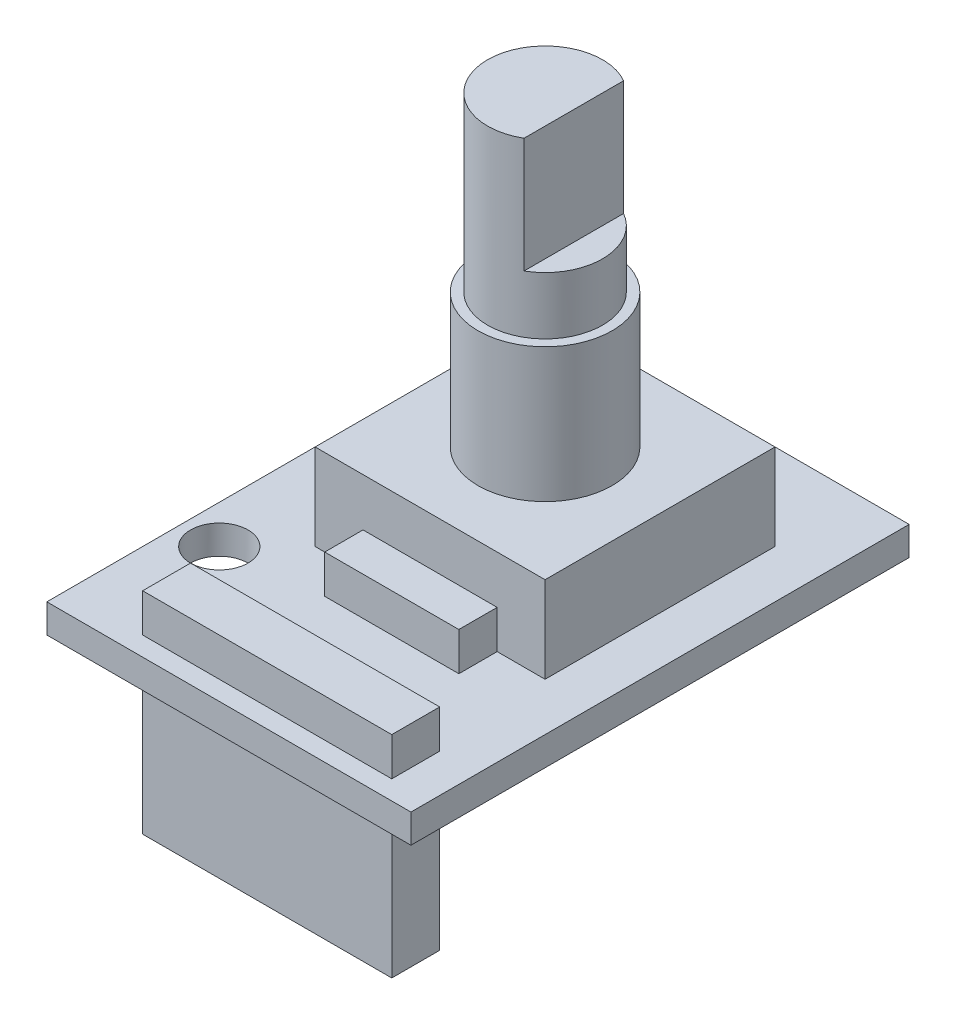
ISO-10303-21;
HEADER;
FILE_DESCRIPTION(('STEP AP214'),'2;1');
FILE_NAME('part.step','',(''),(''),'','','');
FILE_SCHEMA(('AUTOMOTIVE_DESIGN { 1 0 10303 214 1 1 1 1 }'));
ENDSEC;
DATA;
#1=APPLICATION_CONTEXT('core data for automotive mechanical design processes');
#2=APPLICATION_PROTOCOL_DEFINITION('international standard','automotive_design',2000,#1);
#3=PRODUCT_CONTEXT('',#1,'mechanical');
#4=PRODUCT('Part','Part','',(#3));
#5=PRODUCT_RELATED_PRODUCT_CATEGORY('part','',(#4));
#6=PRODUCT_DEFINITION_FORMATION('','',#4);
#7=PRODUCT_DEFINITION_CONTEXT('part definition',#1,'design');
#8=PRODUCT_DEFINITION('design','',#6,#7);
#9=PRODUCT_DEFINITION_SHAPE('','',#8);
#10=(LENGTH_UNIT() NAMED_UNIT(*) SI_UNIT(.MILLI.,.METRE.));
#11=(NAMED_UNIT(*) PLANE_ANGLE_UNIT() SI_UNIT($,.RADIAN.));
#12=(NAMED_UNIT(*) SI_UNIT($,.STERADIAN.) SOLID_ANGLE_UNIT());
#13=UNCERTAINTY_MEASURE_WITH_UNIT(LENGTH_MEASURE(1.E-05),#10,'distance_accuracy_value','');
#14=(GEOMETRIC_REPRESENTATION_CONTEXT(3) GLOBAL_UNCERTAINTY_ASSIGNED_CONTEXT((#13)) GLOBAL_UNIT_ASSIGNED_CONTEXT((#10,
#11,#12)) REPRESENTATION_CONTEXT('',''));
#15=CARTESIAN_POINT('',(0.,0.,0.));
#16=DIRECTION('',(0.,0.,1.));
#17=DIRECTION('',(1.,0.,0.));
#18=AXIS2_PLACEMENT_3D('',#15,#16,#17);
#19=CARTESIAN_POINT('',(0.,1.5,0.));
#20=DIRECTION('',(0.,-1.,0.));
#21=DIRECTION('',(0.,0.,-1.));
#22=AXIS2_PLACEMENT_3D('',#19,#20,#21);
#23=PLANE('',#22);
#24=DIRECTION('',(-1.,0.,0.));
#25=VECTOR('',#24,1.);
#26=CARTESIAN_POINT('',(0.,1.5,12.));
#27=LINE('',#26,#25);
#28=CARTESIAN_POINT('',(7.5,1.5,12.));
#29=VERTEX_POINT('',#28);
#30=CARTESIAN_POINT('',(-5.5,1.5,12.));
#31=VERTEX_POINT('',#30);
#32=EDGE_CURVE('E363',#29,#31,#27,.T.);
#33=ORIENTED_EDGE('',*,*,#32,.T.);
#34=DIRECTION('',(0.,0.,-1.));
#35=VECTOR('',#34,1.);
#36=CARTESIAN_POINT('',(-5.5,1.5,0.));
#37=LINE('',#36,#35);
#38=CARTESIAN_POINT('',(-5.5,1.5,9.5));
#39=VERTEX_POINT('',#38);
#40=EDGE_CURVE('E372',#31,#39,#37,.T.);
#41=ORIENTED_EDGE('',*,*,#40,.T.);
#42=DIRECTION('',(1.,0.,0.));
#43=VECTOR('',#42,1.);
#44=CARTESIAN_POINT('',(0.,1.5,9.5));
#45=LINE('',#44,#43);
#46=CARTESIAN_POINT('',(7.5,1.5,9.5));
#47=VERTEX_POINT('',#46);
#48=EDGE_CURVE('E369',#39,#47,#45,.T.);
#49=ORIENTED_EDGE('',*,*,#48,.T.);
#50=DIRECTION('',(0.,0.,1.));
#51=VECTOR('',#50,1.);
#52=CARTESIAN_POINT('',(7.5,1.5,0.));
#53=LINE('',#52,#51);
#54=EDGE_CURVE('E366',#47,#29,#53,.T.);
#55=ORIENTED_EDGE('',*,*,#54,.T.);
#56=EDGE_LOOP('',(#33,#41,#49,#55));
#57=FACE_BOUND('',#56,.T.);
#58=CARTESIAN_POINT('',(-7.5,1.5,-7.5));
#59=DIRECTION('',(0.,1.,0.));
#60=DIRECTION('',(0.,0.,1.));
#61=AXIS2_PLACEMENT_3D('',#58,#59,#60);
#62=CIRCLE('',#61,1.5);
#63=CARTESIAN_POINT('',(-7.5,1.5,-6.));
#64=VERTEX_POINT('',#63);
#65=EDGE_CURVE('E324',#64,#64,#62,.T.);
#66=ORIENTED_EDGE('',*,*,#65,.F.);
#67=EDGE_LOOP('',(#66));
#68=FACE_BOUND('',#67,.T.);
#69=CARTESIAN_POINT('',(-7.5,1.5,6.));
#70=DIRECTION('',(0.,1.,0.));
#71=DIRECTION('',(0.,0.,1.));
#72=AXIS2_PLACEMENT_3D('',#69,#70,#71);
#73=CIRCLE('',#72,1.5);
#74=CARTESIAN_POINT('',(-7.5,1.5,7.5));
#75=VERTEX_POINT('',#74);
#76=EDGE_CURVE('E375',#75,#75,#73,.T.);
#77=ORIENTED_EDGE('',*,*,#76,.F.);
#78=EDGE_LOOP('',(#77));
#79=FACE_BOUND('',#78,.T.);
#80=DIRECTION('',(0.,0.,1.));
#81=VECTOR('',#80,1.);
#82=CARTESIAN_POINT('',(-9.5,1.5,13.));
#83=LINE('',#82,#81);
#84=CARTESIAN_POINT('',(-9.5,1.5,-13.));
#85=VERTEX_POINT('',#84);
#86=CARTESIAN_POINT('',(-9.5,1.5,13.));
#87=VERTEX_POINT('',#86);
#88=EDGE_CURVE('E290',#85,#87,#83,.T.);
#89=ORIENTED_EDGE('',*,*,#88,.T.);
#90=DIRECTION('',(1.,0.,0.));
#91=VECTOR('',#90,1.);
#92=CARTESIAN_POINT('',(-9.5,1.5,13.));
#93=LINE('',#92,#91);
#94=CARTESIAN_POINT('',(9.5,1.5,13.));
#95=VERTEX_POINT('',#94);
#96=EDGE_CURVE('E293',#87,#95,#93,.T.);
#97=ORIENTED_EDGE('',*,*,#96,.T.);
#98=DIRECTION('',(0.,0.,-1.));
#99=VECTOR('',#98,1.);
#100=CARTESIAN_POINT('',(9.5,1.5,13.));
#101=LINE('',#100,#99);
#102=CARTESIAN_POINT('',(9.5,1.5,-13.));
#103=VERTEX_POINT('',#102);
#104=EDGE_CURVE('E296',#95,#103,#101,.T.);
#105=ORIENTED_EDGE('',*,*,#104,.T.);
#106=DIRECTION('',(-1.,0.,0.));
#107=VECTOR('',#106,1.);
#108=CARTESIAN_POINT('',(-9.5,1.5,-13.));
#109=LINE('',#108,#107);
#110=EDGE_CURVE('E298',#103,#85,#109,.T.);
#111=ORIENTED_EDGE('',*,*,#110,.T.);
#112=EDGE_LOOP('',(#89,#97,#105,#111));
#113=FACE_BOUND('',#112,.T.);
#114=DIRECTION('',(0.,0.,1.));
#115=VECTOR('',#114,1.);
#116=CARTESIAN_POINT('',(-2.5,1.5,3.5));
#117=LINE('',#116,#115);
#118=CARTESIAN_POINT('',(-2.5,1.5,3.5));
#119=VERTEX_POINT('',#118);
#120=CARTESIAN_POINT('',(-2.5,1.5,5.5));
#121=VERTEX_POINT('',#120);
#122=EDGE_CURVE('E245',#119,#121,#117,.T.);
#123=ORIENTED_EDGE('',*,*,#122,.F.);
#124=DIRECTION('',(1.,0.,0.));
#125=VECTOR('',#124,1.);
#126=CARTESIAN_POINT('',(-5.,1.5,3.5));
#127=LINE('',#126,#125);
#128=CARTESIAN_POINT('',(-5.,1.5,3.5));
#129=VERTEX_POINT('',#128);
#130=EDGE_CURVE('E255',#129,#119,#127,.T.);
#131=ORIENTED_EDGE('',*,*,#130,.F.);
#132=DIRECTION('',(0.,0.,1.));
#133=VECTOR('',#132,1.);
#134=CARTESIAN_POINT('',(-5.,1.5,3.5));
#135=LINE('',#134,#133);
#136=CARTESIAN_POINT('',(-5.,1.5,-8.5));
#137=VERTEX_POINT('',#136);
#138=EDGE_CURVE('E270',#137,#129,#135,.T.);
#139=ORIENTED_EDGE('',*,*,#138,.F.);
#140=DIRECTION('',(-1.,0.,0.));
#141=VECTOR('',#140,1.);
#142=CARTESIAN_POINT('',(-5.,1.5,-8.5));
#143=LINE('',#142,#141);
#144=CARTESIAN_POINT('',(-2.5,1.5,-8.5));
#145=VERTEX_POINT('',#144);
#146=EDGE_CURVE('E268',#145,#137,#143,.T.);
#147=ORIENTED_EDGE('',*,*,#146,.F.);
#148=DIRECTION('',(0.,0.,1.));
#149=VECTOR('',#148,1.);
#150=CARTESIAN_POINT('',(-2.5,1.5,-8.5));
#151=LINE('',#150,#149);
#152=CARTESIAN_POINT('',(-2.5,1.5,-10.5));
#153=VERTEX_POINT('',#152);
#154=EDGE_CURVE('E64',#153,#145,#151,.T.);
#155=ORIENTED_EDGE('',*,*,#154,.F.);
#156=DIRECTION('',(-1.,0.,0.));
#157=VECTOR('',#156,1.);
#158=CARTESIAN_POINT('',(-2.5,1.5,-10.5));
#159=LINE('',#158,#157);
#160=CARTESIAN_POINT('',(4.5,1.5,-10.5));
#161=VERTEX_POINT('',#160);
#162=EDGE_CURVE('E428',#161,#153,#159,.T.);
#163=ORIENTED_EDGE('',*,*,#162,.F.);
#164=DIRECTION('',(0.,0.,-1.));
#165=VECTOR('',#164,1.);
#166=CARTESIAN_POINT('',(4.5,1.5,-8.5));
#167=LINE('',#166,#165);
#168=CARTESIAN_POINT('',(4.5,1.5,-8.5));
#169=VERTEX_POINT('',#168);
#170=EDGE_CURVE('E425',#169,#161,#167,.T.);
#171=ORIENTED_EDGE('',*,*,#170,.F.);
#172=CARTESIAN_POINT('',(7.,1.5,-8.5));
#173=VERTEX_POINT('',#172);
#174=EDGE_CURVE('E274',#173,#169,#143,.T.);
#175=ORIENTED_EDGE('',*,*,#174,.F.);
#176=DIRECTION('',(0.,0.,-1.));
#177=VECTOR('',#176,1.);
#178=CARTESIAN_POINT('',(7.,1.5,3.5));
#179=LINE('',#178,#177);
#180=CARTESIAN_POINT('',(7.,1.5,3.5));
#181=VERTEX_POINT('',#180);
#182=EDGE_CURVE('E264',#181,#173,#179,.T.);
#183=ORIENTED_EDGE('',*,*,#182,.F.);
#184=CARTESIAN_POINT('',(4.5,1.5,3.5));
#185=VERTEX_POINT('',#184);
#186=EDGE_CURVE('E265',#185,#181,#127,.T.);
#187=ORIENTED_EDGE('',*,*,#186,.F.);
#188=DIRECTION('',(0.,0.,-1.));
#189=VECTOR('',#188,1.);
#190=CARTESIAN_POINT('',(4.5,1.5,3.5));
#191=LINE('',#190,#189);
#192=CARTESIAN_POINT('',(4.5,1.5,5.5));
#193=VERTEX_POINT('',#192);
#194=EDGE_CURVE('E671',#193,#185,#191,.T.);
#195=ORIENTED_EDGE('',*,*,#194,.F.);
#196=DIRECTION('',(1.,0.,0.));
#197=VECTOR('',#196,1.);
#198=CARTESIAN_POINT('',(-2.5,1.5,5.5));
#199=LINE('',#198,#197);
#200=EDGE_CURVE('E258',#121,#193,#199,.T.);
#201=ORIENTED_EDGE('',*,*,#200,.F.);
#202=EDGE_LOOP('',(#123,#131,#139,#147,#155,#163,#171,#175,#183,#187,#195,#201));
#203=FACE_BOUND('',#202,.T.);
#204=ADVANCED_FACE('F41',(#57,#68,#79,#113,#203),#23,.F.);
#205=CARTESIAN_POINT('',(-5.,6.,3.5));
#206=DIRECTION('',(0.,0.,-1.));
#207=DIRECTION('',(-1.,0.,0.));
#208=AXIS2_PLACEMENT_3D('',#205,#206,#207);
#209=PLANE('',#208);
#210=DIRECTION('',(0.,-1.,0.));
#211=VECTOR('',#210,1.);
#212=CARTESIAN_POINT('',(-2.5,3.5,3.5));
#213=LINE('',#212,#211);
#214=CARTESIAN_POINT('',(-2.5,3.5,3.5));
#215=VERTEX_POINT('',#214);
#216=EDGE_CURVE('E241',#215,#119,#213,.T.);
#217=ORIENTED_EDGE('',*,*,#216,.F.);
#218=DIRECTION('',(-1.,0.,0.));
#219=VECTOR('',#218,1.);
#220=CARTESIAN_POINT('',(-2.5,3.5,3.5));
#221=LINE('',#220,#219);
#222=CARTESIAN_POINT('',(4.5,3.5,3.5));
#223=VERTEX_POINT('',#222);
#224=EDGE_CURVE('E252',#223,#215,#221,.T.);
#225=ORIENTED_EDGE('',*,*,#224,.F.);
#226=DIRECTION('',(0.,-1.,0.));
#227=VECTOR('',#226,1.);
#228=CARTESIAN_POINT('',(4.5,3.5,3.5));
#229=LINE('',#228,#227);
#230=EDGE_CURVE('E56',#223,#185,#229,.T.);
#231=ORIENTED_EDGE('',*,*,#230,.T.);
#232=ORIENTED_EDGE('',*,*,#186,.T.);
#233=DIRECTION('',(0.,-1.,0.));
#234=VECTOR('',#233,1.);
#235=CARTESIAN_POINT('',(7.,6.,3.5));
#236=LINE('',#235,#234);
#237=CARTESIAN_POINT('',(7.,6.,3.5));
#238=VERTEX_POINT('',#237);
#239=EDGE_CURVE('E285',#238,#181,#236,.T.);
#240=ORIENTED_EDGE('',*,*,#239,.F.);
#241=DIRECTION('',(1.,0.,0.));
#242=VECTOR('',#241,1.);
#243=CARTESIAN_POINT('',(-5.,6.,3.5));
#244=LINE('',#243,#242);
#245=CARTESIAN_POINT('',(-5.,6.,3.5));
#246=VERTEX_POINT('',#245);
#247=EDGE_CURVE('E403',#246,#238,#244,.T.);
#248=ORIENTED_EDGE('',*,*,#247,.F.);
#249=DIRECTION('',(0.,-1.,0.));
#250=VECTOR('',#249,1.);
#251=CARTESIAN_POINT('',(-5.,6.,3.5));
#252=LINE('',#251,#250);
#253=EDGE_CURVE('E262',#246,#129,#252,.T.);
#254=ORIENTED_EDGE('',*,*,#253,.T.);
#255=ORIENTED_EDGE('',*,*,#130,.T.);
#256=EDGE_LOOP('',(#217,#225,#231,#232,#240,#248,#254,#255));
#257=FACE_BOUND('',#256,.T.);
#258=ADVANCED_FACE('F260',(#257),#209,.F.);
#259=CARTESIAN_POINT('',(-5.,6.,-8.5));
#260=DIRECTION('',(0.,0.,1.));
#261=DIRECTION('',(1.,0.,0.));
#262=AXIS2_PLACEMENT_3D('',#259,#260,#261);
#263=PLANE('',#262);
#264=DIRECTION('',(0.,-1.,0.));
#265=VECTOR('',#264,1.);
#266=CARTESIAN_POINT('',(-2.5,3.5,-8.5));
#267=LINE('',#266,#265);
#268=CARTESIAN_POINT('',(-2.5,3.5,-8.5));
#269=VERTEX_POINT('',#268);
#270=EDGE_CURVE('E422',#269,#145,#267,.T.);
#271=ORIENTED_EDGE('',*,*,#270,.T.);
#272=ORIENTED_EDGE('',*,*,#146,.T.);
#273=DIRECTION('',(0.,-1.,0.));
#274=VECTOR('',#273,1.);
#275=CARTESIAN_POINT('',(-5.,6.,-8.5));
#276=LINE('',#275,#274);
#277=CARTESIAN_POINT('',(-5.,6.,-8.5));
#278=VERTEX_POINT('',#277);
#279=EDGE_CURVE('E278',#278,#137,#276,.T.);
#280=ORIENTED_EDGE('',*,*,#279,.F.);
#281=DIRECTION('',(-1.,0.,0.));
#282=VECTOR('',#281,1.);
#283=CARTESIAN_POINT('',(-5.,6.,-8.5));
#284=LINE('',#283,#282);
#285=CARTESIAN_POINT('',(7.,6.,-8.5));
#286=VERTEX_POINT('',#285);
#287=EDGE_CURVE('E282',#286,#278,#284,.T.);
#288=ORIENTED_EDGE('',*,*,#287,.F.);
#289=DIRECTION('',(0.,-1.,0.));
#290=VECTOR('',#289,1.);
#291=CARTESIAN_POINT('',(7.,6.,-8.5));
#292=LINE('',#291,#290);
#293=EDGE_CURVE('E281',#286,#173,#292,.T.);
#294=ORIENTED_EDGE('',*,*,#293,.T.);
#295=ORIENTED_EDGE('',*,*,#174,.T.);
#296=DIRECTION('',(0.,-1.,0.));
#297=VECTOR('',#296,1.);
#298=CARTESIAN_POINT('',(4.5,3.5,-8.5));
#299=LINE('',#298,#297);
#300=CARTESIAN_POINT('',(4.5,3.5,-8.5));
#301=VERTEX_POINT('',#300);
#302=EDGE_CURVE('E440',#301,#169,#299,.T.);
#303=ORIENTED_EDGE('',*,*,#302,.F.);
#304=DIRECTION('',(1.,0.,0.));
#305=VECTOR('',#304,1.);
#306=CARTESIAN_POINT('',(-2.5,3.5,-8.5));
#307=LINE('',#306,#305);
#308=EDGE_CURVE('E665',#269,#301,#307,.T.);
#309=ORIENTED_EDGE('',*,*,#308,.F.);
#310=EDGE_LOOP('',(#271,#272,#280,#288,#294,#295,#303,#309));
#311=FACE_BOUND('',#310,.T.);
#312=ADVANCED_FACE('F414',(#311),#263,.F.);
#313=CARTESIAN_POINT('',(0.,0.,0.));
#314=DIRECTION('',(0.,-1.,0.));
#315=DIRECTION('',(0.,0.,-1.));
#316=AXIS2_PLACEMENT_3D('',#313,#314,#315);
#317=PLANE('',#316);
#318=DIRECTION('',(0.,0.,-1.));
#319=VECTOR('',#318,1.);
#320=CARTESIAN_POINT('',(-5.5,0.,0.));
#321=LINE('',#320,#319);
#322=CARTESIAN_POINT('',(-5.5,0.,12.));
#323=VERTEX_POINT('',#322);
#324=CARTESIAN_POINT('',(-5.5,0.,9.5));
#325=VERTEX_POINT('',#324);
#326=EDGE_CURVE('E11',#323,#325,#321,.T.);
#327=ORIENTED_EDGE('',*,*,#326,.F.);
#328=DIRECTION('',(-1.,0.,0.));
#329=VECTOR('',#328,1.);
#330=CARTESIAN_POINT('',(0.,0.,12.));
#331=LINE('',#330,#329);
#332=CARTESIAN_POINT('',(7.5,0.,12.));
#333=VERTEX_POINT('',#332);
#334=EDGE_CURVE('E328',#333,#323,#331,.T.);
#335=ORIENTED_EDGE('',*,*,#334,.F.);
#336=DIRECTION('',(0.,0.,1.));
#337=VECTOR('',#336,1.);
#338=CARTESIAN_POINT('',(7.5,0.,0.));
#339=LINE('',#338,#337);
#340=CARTESIAN_POINT('',(7.5,0.,9.5));
#341=VERTEX_POINT('',#340);
#342=EDGE_CURVE('E331',#341,#333,#339,.T.);
#343=ORIENTED_EDGE('',*,*,#342,.F.);
#344=DIRECTION('',(1.,0.,0.));
#345=VECTOR('',#344,1.);
#346=CARTESIAN_POINT('',(0.,0.,9.5));
#347=LINE('',#346,#345);
#348=EDGE_CURVE('E49',#325,#341,#347,.T.);
#349=ORIENTED_EDGE('',*,*,#348,.F.);
#350=EDGE_LOOP('',(#327,#335,#343,#349));
#351=FACE_BOUND('',#350,.T.);
#352=CARTESIAN_POINT('',(-7.5,0.,-7.5));
#353=DIRECTION('',(0.,-1.,0.));
#354=DIRECTION('',(0.,0.,-1.));
#355=AXIS2_PLACEMENT_3D('',#352,#353,#354);
#356=CIRCLE('',#355,1.5);
#357=CARTESIAN_POINT('',(-7.5,0.,-9.));
#358=VERTEX_POINT('',#357);
#359=EDGE_CURVE('E323',#358,#358,#356,.T.);
#360=ORIENTED_EDGE('',*,*,#359,.F.);
#361=EDGE_LOOP('',(#360));
#362=FACE_BOUND('',#361,.T.);
#363=CARTESIAN_POINT('',(-7.5,0.,6.));
#364=DIRECTION('',(0.,-1.,0.));
#365=DIRECTION('',(0.,0.,-1.));
#366=AXIS2_PLACEMENT_3D('',#363,#364,#365);
#367=CIRCLE('',#366,1.5);
#368=CARTESIAN_POINT('',(-7.5,0.,4.5));
#369=VERTEX_POINT('',#368);
#370=EDGE_CURVE('E320',#369,#369,#367,.T.);
#371=ORIENTED_EDGE('',*,*,#370,.F.);
#372=EDGE_LOOP('',(#371));
#373=FACE_BOUND('',#372,.T.);
#374=DIRECTION('',(0.,0.,1.));
#375=VECTOR('',#374,1.);
#376=CARTESIAN_POINT('',(-9.5,0.,13.));
#377=LINE('',#376,#375);
#378=CARTESIAN_POINT('',(-9.5,0.,-13.));
#379=VERTEX_POINT('',#378);
#380=CARTESIAN_POINT('',(-9.5,0.,13.));
#381=VERTEX_POINT('',#380);
#382=EDGE_CURVE('E289',#379,#381,#377,.T.);
#383=ORIENTED_EDGE('',*,*,#382,.F.);
#384=DIRECTION('',(-1.,0.,0.));
#385=VECTOR('',#384,1.);
#386=CARTESIAN_POINT('',(-9.5,0.,-13.));
#387=LINE('',#386,#385);
#388=CARTESIAN_POINT('',(9.5,0.,-13.));
#389=VERTEX_POINT('',#388);
#390=EDGE_CURVE('E294',#389,#379,#387,.T.);
#391=ORIENTED_EDGE('',*,*,#390,.F.);
#392=DIRECTION('',(0.,0.,-1.));
#393=VECTOR('',#392,1.);
#394=CARTESIAN_POINT('',(9.5,0.,13.));
#395=LINE('',#394,#393);
#396=CARTESIAN_POINT('',(9.5,0.,13.));
#397=VERTEX_POINT('',#396);
#398=EDGE_CURVE('E305',#397,#389,#395,.T.);
#399=ORIENTED_EDGE('',*,*,#398,.F.);
#400=DIRECTION('',(1.,0.,0.));
#401=VECTOR('',#400,1.);
#402=CARTESIAN_POINT('',(-9.5,0.,13.));
#403=LINE('',#402,#401);
#404=EDGE_CURVE('E303',#381,#397,#403,.T.);
#405=ORIENTED_EDGE('',*,*,#404,.F.);
#406=EDGE_LOOP('',(#383,#391,#399,#405));
#407=FACE_BOUND('',#406,.T.);
#408=DIRECTION('',(1.,0.,0.));
#409=VECTOR('',#408,1.);
#410=CARTESIAN_POINT('',(-3.,0.,-12.));
#411=LINE('',#410,#409);
#412=CARTESIAN_POINT('',(-3.,0.,-12.));
#413=VERTEX_POINT('',#412);
#414=CARTESIAN_POINT('',(6.5,0.,-12.));
#415=VERTEX_POINT('',#414);
#416=EDGE_CURVE('E458',#413,#415,#411,.T.);
#417=ORIENTED_EDGE('',*,*,#416,.F.);
#418=DIRECTION('',(0.,0.,-1.));
#419=VECTOR('',#418,1.);
#420=CARTESIAN_POINT('',(-3.,0.,6.5));
#421=LINE('',#420,#419);
#422=CARTESIAN_POINT('',(-3.,0.,6.5));
#423=VERTEX_POINT('',#422);
#424=EDGE_CURVE('E444',#423,#413,#421,.T.);
#425=ORIENTED_EDGE('',*,*,#424,.F.);
#426=DIRECTION('',(-1.,0.,0.));
#427=VECTOR('',#426,1.);
#428=CARTESIAN_POINT('',(-3.,0.,6.5));
#429=LINE('',#428,#427);
#430=CARTESIAN_POINT('',(6.5,0.,6.5));
#431=VERTEX_POINT('',#430);
#432=EDGE_CURVE('E449',#431,#423,#429,.T.);
#433=ORIENTED_EDGE('',*,*,#432,.F.);
#434=DIRECTION('',(0.,0.,1.));
#435=VECTOR('',#434,1.);
#436=CARTESIAN_POINT('',(6.5,0.,6.5));
#437=LINE('',#436,#435);
#438=EDGE_CURVE('E460',#415,#431,#437,.T.);
#439=ORIENTED_EDGE('',*,*,#438,.F.);
#440=EDGE_LOOP('',(#417,#425,#433,#439));
#441=FACE_BOUND('',#440,.T.);
#442=ADVANCED_FACE('F530',(#351,#362,#373,#407,#441),#317,.T.);
#443=CARTESIAN_POINT('',(-9.5,1.5,13.));
#444=DIRECTION('',(1.,0.,0.));
#445=DIRECTION('',(0.,0.,-1.));
#446=AXIS2_PLACEMENT_3D('',#443,#444,#445);
#447=PLANE('',#446);
#448=ORIENTED_EDGE('',*,*,#382,.T.);
#449=DIRECTION('',(0.,-1.,0.));
#450=VECTOR('',#449,1.);
#451=CARTESIAN_POINT('',(-9.5,1.5,13.));
#452=LINE('',#451,#450);
#453=EDGE_CURVE('E316',#87,#381,#452,.T.);
#454=ORIENTED_EDGE('',*,*,#453,.F.);
#455=ORIENTED_EDGE('',*,*,#88,.F.);
#456=DIRECTION('',(0.,-1.,0.));
#457=VECTOR('',#456,1.);
#458=CARTESIAN_POINT('',(-9.5,1.5,-13.));
#459=LINE('',#458,#457);
#460=EDGE_CURVE('E300',#85,#379,#459,.T.);
#461=ORIENTED_EDGE('',*,*,#460,.T.);
#462=EDGE_LOOP('',(#448,#454,#455,#461));
#463=FACE_BOUND('',#462,.T.);
#464=ADVANCED_FACE('F43',(#463),#447,.F.);
#465=CARTESIAN_POINT('',(-9.5,1.5,13.));
#466=DIRECTION('',(0.,0.,-1.));
#467=DIRECTION('',(-1.,0.,0.));
#468=AXIS2_PLACEMENT_3D('',#465,#466,#467);
#469=PLANE('',#468);
#470=ORIENTED_EDGE('',*,*,#404,.T.);
#471=DIRECTION('',(0.,-1.,0.));
#472=VECTOR('',#471,1.);
#473=CARTESIAN_POINT('',(9.5,1.5,13.));
#474=LINE('',#473,#472);
#475=EDGE_CURVE('E313',#95,#397,#474,.T.);
#476=ORIENTED_EDGE('',*,*,#475,.F.);
#477=ORIENTED_EDGE('',*,*,#96,.F.);
#478=ORIENTED_EDGE('',*,*,#453,.T.);
#479=EDGE_LOOP('',(#470,#476,#477,#478));
#480=FACE_BOUND('',#479,.T.);
#481=ADVANCED_FACE('F539',(#480),#469,.F.);
#482=CARTESIAN_POINT('',(9.5,1.5,13.));
#483=DIRECTION('',(-1.,0.,0.));
#484=DIRECTION('',(0.,0.,1.));
#485=AXIS2_PLACEMENT_3D('',#482,#483,#484);
#486=PLANE('',#485);
#487=ORIENTED_EDGE('',*,*,#398,.T.);
#488=DIRECTION('',(0.,-1.,0.));
#489=VECTOR('',#488,1.);
#490=CARTESIAN_POINT('',(9.5,1.5,-13.));
#491=LINE('',#490,#489);
#492=EDGE_CURVE('E310',#103,#389,#491,.T.);
#493=ORIENTED_EDGE('',*,*,#492,.F.);
#494=ORIENTED_EDGE('',*,*,#104,.F.);
#495=ORIENTED_EDGE('',*,*,#475,.T.);
#496=EDGE_LOOP('',(#487,#493,#494,#495));
#497=FACE_BOUND('',#496,.T.);
#498=ADVANCED_FACE('F536',(#497),#486,.F.);
#499=CARTESIAN_POINT('',(-9.5,1.5,-13.));
#500=DIRECTION('',(0.,0.,1.));
#501=DIRECTION('',(1.,0.,0.));
#502=AXIS2_PLACEMENT_3D('',#499,#500,#501);
#503=PLANE('',#502);
#504=ORIENTED_EDGE('',*,*,#390,.T.);
#505=ORIENTED_EDGE('',*,*,#460,.F.);
#506=ORIENTED_EDGE('',*,*,#110,.F.);
#507=ORIENTED_EDGE('',*,*,#492,.T.);
#508=EDGE_LOOP('',(#504,#505,#506,#507));
#509=FACE_BOUND('',#508,.T.);
#510=ADVANCED_FACE('F533',(#509),#503,.F.);
#511=CARTESIAN_POINT('',(-5.,6.,3.5));
#512=DIRECTION('',(1.,0.,0.));
#513=DIRECTION('',(0.,0.,-1.));
#514=AXIS2_PLACEMENT_3D('',#511,#512,#513);
#515=PLANE('',#514);
#516=ORIENTED_EDGE('',*,*,#138,.T.);
#517=ORIENTED_EDGE('',*,*,#253,.F.);
#518=DIRECTION('',(0.,0.,1.));
#519=VECTOR('',#518,1.);
#520=CARTESIAN_POINT('',(-5.,6.,3.5));
#521=LINE('',#520,#519);
#522=EDGE_CURVE('E277',#278,#246,#521,.T.);
#523=ORIENTED_EDGE('',*,*,#522,.F.);
#524=ORIENTED_EDGE('',*,*,#279,.T.);
#525=EDGE_LOOP('',(#516,#517,#523,#524));
#526=FACE_BOUND('',#525,.T.);
#527=ADVANCED_FACE('F416',(#526),#515,.F.);
#528=CARTESIAN_POINT('',(7.,6.,3.5));
#529=DIRECTION('',(-1.,0.,0.));
#530=DIRECTION('',(0.,0.,1.));
#531=AXIS2_PLACEMENT_3D('',#528,#529,#530);
#532=PLANE('',#531);
#533=ORIENTED_EDGE('',*,*,#182,.T.);
#534=ORIENTED_EDGE('',*,*,#293,.F.);
#535=DIRECTION('',(0.,0.,-1.));
#536=VECTOR('',#535,1.);
#537=CARTESIAN_POINT('',(7.,6.,3.5));
#538=LINE('',#537,#536);
#539=EDGE_CURVE('E405',#238,#286,#538,.T.);
#540=ORIENTED_EDGE('',*,*,#539,.F.);
#541=ORIENTED_EDGE('',*,*,#239,.T.);
#542=EDGE_LOOP('',(#533,#534,#540,#541));
#543=FACE_BOUND('',#542,.T.);
#544=ADVANCED_FACE('F645',(#543),#532,.F.);
#545=CARTESIAN_POINT('',(0.,6.,0.));
#546=DIRECTION('',(0.,-1.,0.));
#547=DIRECTION('',(0.,0.,-1.));
#548=AXIS2_PLACEMENT_3D('',#545,#546,#547);
#549=PLANE('',#548);
#550=CARTESIAN_POINT('',(0.999999999999999,6.,-2.5));
#551=DIRECTION('',(0.,1.,0.));
#552=DIRECTION('',(0.,0.,1.));
#553=AXIS2_PLACEMENT_3D('',#550,#551,#552);
#554=CIRCLE('',#553,3.5);
#555=CARTESIAN_POINT('',(0.999999999999999,6.,1.));
#556=VERTEX_POINT('',#555);
#557=EDGE_CURVE('E319',#556,#556,#554,.T.);
#558=ORIENTED_EDGE('',*,*,#557,.F.);
#559=EDGE_LOOP('',(#558));
#560=FACE_BOUND('',#559,.T.);
#561=ORIENTED_EDGE('',*,*,#522,.T.);
#562=ORIENTED_EDGE('',*,*,#247,.T.);
#563=ORIENTED_EDGE('',*,*,#539,.T.);
#564=ORIENTED_EDGE('',*,*,#287,.T.);
#565=EDGE_LOOP('',(#561,#562,#563,#564));
#566=FACE_BOUND('',#565,.T.);
#567=ADVANCED_FACE('F409',(#560,#566),#549,.F.);
#568=CARTESIAN_POINT('',(0.999999999999999,13.,-2.5));
#569=DIRECTION('',(0.,-1.,0.));
#570=DIRECTION('',(0.,0.,-1.));
#571=AXIS2_PLACEMENT_3D('',#568,#569,#570);
#572=CYLINDRICAL_SURFACE('',#571,3.5);
#573=CARTESIAN_POINT('',(0.999999999999999,13.,-2.5));
#574=DIRECTION('',(0.,1.,0.));
#575=DIRECTION('',(0.,0.,1.));
#576=AXIS2_PLACEMENT_3D('',#573,#574,#575);
#577=CIRCLE('',#576,3.5);
#578=CARTESIAN_POINT('',(0.999999999999999,13.,1.));
#579=VERTEX_POINT('',#578);
#580=EDGE_CURVE('E394',#579,#579,#577,.T.);
#581=ORIENTED_EDGE('',*,*,#580,.F.);
#582=EDGE_LOOP('',(#581));
#583=FACE_BOUND('',#582,.T.);
#584=ORIENTED_EDGE('',*,*,#557,.T.);
#585=EDGE_LOOP('',(#584));
#586=FACE_BOUND('',#585,.T.);
#587=ADVANCED_FACE('F638',(#583,#586),#572,.T.);
#588=CARTESIAN_POINT('',(0.999999999999999,13.,-2.5));
#589=DIRECTION('',(0.,1.,0.));
#590=DIRECTION('',(0.,0.,1.));
#591=AXIS2_PLACEMENT_3D('',#588,#589,#590);
#592=PLANE('',#591);
#593=CARTESIAN_POINT('',(0.999999999999999,13.,-2.5));
#594=DIRECTION('',(0.,1.,0.));
#595=DIRECTION('',(0.,0.,1.));
#596=AXIS2_PLACEMENT_3D('',#593,#594,#595);
#597=CIRCLE('',#596,3.);
#598=CARTESIAN_POINT('',(0.999999999999999,13.,0.5));
#599=VERTEX_POINT('',#598);
#600=EDGE_CURVE('E332',#599,#599,#597,.T.);
#601=ORIENTED_EDGE('',*,*,#600,.F.);
#602=EDGE_LOOP('',(#601));
#603=FACE_BOUND('',#602,.T.);
#604=ORIENTED_EDGE('',*,*,#580,.T.);
#605=EDGE_LOOP('',(#604));
#606=FACE_BOUND('',#605,.T.);
#607=ADVANCED_FACE('F634',(#603,#606),#592,.T.);
#608=CARTESIAN_POINT('',(0.999999999999999,22.,-2.5));
#609=DIRECTION('',(0.,-1.,0.));
#610=DIRECTION('',(0.,0.,-1.));
#611=AXIS2_PLACEMENT_3D('',#608,#609,#610);
#612=CYLINDRICAL_SURFACE('',#611,3.);
#613=CARTESIAN_POINT('',(0.999999999999999,22.,-2.5));
#614=DIRECTION('',(0.,1.,0.));
#615=DIRECTION('',(0.,0.,1.));
#616=AXIS2_PLACEMENT_3D('',#613,#614,#615);
#617=CIRCLE('',#616,3.);
#618=CARTESIAN_POINT('',(2.5,22.,-5.09807621135332));
#619=VERTEX_POINT('',#618);
#620=CARTESIAN_POINT('',(2.5,22.,0.0980762113533158));
#621=VERTEX_POINT('',#620);
#622=EDGE_CURVE('E390',#619,#621,#617,.T.);
#623=ORIENTED_EDGE('',*,*,#622,.F.);
#624=DIRECTION('',(0.,1.,0.));
#625=VECTOR('',#624,1.);
#626=CARTESIAN_POINT('',(2.5,16.,-5.09807621135332));
#627=LINE('',#626,#625);
#628=CARTESIAN_POINT('',(2.5,16.,-5.09807621135332));
#629=VERTEX_POINT('',#628);
#630=EDGE_CURVE('E385',#629,#619,#627,.T.);
#631=ORIENTED_EDGE('',*,*,#630,.F.);
#632=CARTESIAN_POINT('',(0.999999999999999,16.,-2.5));
#633=DIRECTION('',(0.,1.,0.));
#634=DIRECTION('',(0.,0.,1.));
#635=AXIS2_PLACEMENT_3D('',#632,#633,#634);
#636=CIRCLE('',#635,3.);
#637=CARTESIAN_POINT('',(2.5,16.,0.0980762113533158));
#638=VERTEX_POINT('',#637);
#639=EDGE_CURVE('E380',#638,#629,#636,.T.);
#640=ORIENTED_EDGE('',*,*,#639,.F.);
#641=DIRECTION('',(0.,1.,0.));
#642=VECTOR('',#641,1.);
#643=CARTESIAN_POINT('',(2.5,16.,0.0980762113533158));
#644=LINE('',#643,#642);
#645=EDGE_CURVE('E387',#638,#621,#644,.T.);
#646=ORIENTED_EDGE('',*,*,#645,.T.);
#647=EDGE_LOOP('',(#623,#631,#640,#646));
#648=FACE_BOUND('',#647,.T.);
#649=ORIENTED_EDGE('',*,*,#600,.T.);
#650=EDGE_LOOP('',(#649));
#651=FACE_BOUND('',#650,.T.);
#652=ADVANCED_FACE('F630',(#648,#651),#612,.T.);
#653=CARTESIAN_POINT('',(0.999999999999999,22.,-2.5));
#654=DIRECTION('',(0.,1.,0.));
#655=DIRECTION('',(0.,0.,1.));
#656=AXIS2_PLACEMENT_3D('',#653,#654,#655);
#657=PLANE('',#656);
#658=DIRECTION('',(0.,0.,1.));
#659=VECTOR('',#658,1.);
#660=CARTESIAN_POINT('',(2.5,22.,0.));
#661=LINE('',#660,#659);
#662=EDGE_CURVE('E327',#619,#621,#661,.T.);
#663=ORIENTED_EDGE('',*,*,#662,.F.);
#664=ORIENTED_EDGE('',*,*,#622,.T.);
#665=EDGE_LOOP('',(#663,#664));
#666=FACE_BOUND('',#665,.T.);
#667=ADVANCED_FACE('F626',(#666),#657,.T.);
#668=CARTESIAN_POINT('',(2.5,16.,0.));
#669=DIRECTION('',(-1.,0.,0.));
#670=DIRECTION('',(0.,0.,1.));
#671=AXIS2_PLACEMENT_3D('',#668,#669,#670);
#672=PLANE('',#671);
#673=ORIENTED_EDGE('',*,*,#662,.T.);
#674=ORIENTED_EDGE('',*,*,#645,.F.);
#675=DIRECTION('',(0.,0.,1.));
#676=VECTOR('',#675,1.);
#677=CARTESIAN_POINT('',(2.5,16.,0.));
#678=LINE('',#677,#676);
#679=EDGE_CURVE('E382',#629,#638,#678,.T.);
#680=ORIENTED_EDGE('',*,*,#679,.F.);
#681=ORIENTED_EDGE('',*,*,#630,.T.);
#682=EDGE_LOOP('',(#673,#674,#680,#681));
#683=FACE_BOUND('',#682,.T.);
#684=ADVANCED_FACE('F622',(#683),#672,.F.);
#685=CARTESIAN_POINT('',(0.,16.,0.));
#686=DIRECTION('',(0.,1.,0.));
#687=DIRECTION('',(0.,0.,1.));
#688=AXIS2_PLACEMENT_3D('',#685,#686,#687);
#689=PLANE('',#688);
#690=ORIENTED_EDGE('',*,*,#639,.T.);
#691=ORIENTED_EDGE('',*,*,#679,.T.);
#692=EDGE_LOOP('',(#690,#691));
#693=FACE_BOUND('',#692,.T.);
#694=ADVANCED_FACE('F618',(#693),#689,.T.);
#695=CARTESIAN_POINT('',(-7.5,-4.5,6.));
#696=DIRECTION('',(0.,1.,0.));
#697=DIRECTION('',(0.,0.,1.));
#698=AXIS2_PLACEMENT_3D('',#695,#696,#697);
#699=CYLINDRICAL_SURFACE('',#698,1.5);
#700=ORIENTED_EDGE('',*,*,#370,.T.);
#701=EDGE_LOOP('',(#700));
#702=FACE_BOUND('',#701,.T.);
#703=ORIENTED_EDGE('',*,*,#76,.T.);
#704=EDGE_LOOP('',(#703));
#705=FACE_BOUND('',#704,.T.);
#706=ADVANCED_FACE('F614',(#702,#705),#699,.F.);
#707=CARTESIAN_POINT('',(-7.5,-4.5,-7.5));
#708=DIRECTION('',(0.,1.,0.));
#709=DIRECTION('',(0.,0.,1.));
#710=AXIS2_PLACEMENT_3D('',#707,#708,#709);
#711=CYLINDRICAL_SURFACE('',#710,1.5);
#712=ORIENTED_EDGE('',*,*,#359,.T.);
#713=EDGE_LOOP('',(#712));
#714=FACE_BOUND('',#713,.T.);
#715=ORIENTED_EDGE('',*,*,#65,.T.);
#716=EDGE_LOOP('',(#715));
#717=FACE_BOUND('',#716,.T.);
#718=ADVANCED_FACE('F599',(#714,#717),#711,.F.);
#719=CARTESIAN_POINT('',(0.,-7.5,0.));
#720=DIRECTION('',(0.,-1.,0.));
#721=DIRECTION('',(0.,0.,-1.));
#722=AXIS2_PLACEMENT_3D('',#719,#720,#721);
#723=PLANE('',#722);
#724=DIRECTION('',(0.,0.,1.));
#725=VECTOR('',#724,1.);
#726=CARTESIAN_POINT('',(-5.5,-7.5,12.));
#727=LINE('',#726,#725);
#728=CARTESIAN_POINT('',(-5.5,-7.5,9.5));
#729=VERTEX_POINT('',#728);
#730=CARTESIAN_POINT('',(-5.5,-7.5,12.));
#731=VERTEX_POINT('',#730);
#732=EDGE_CURVE('E485',#729,#731,#727,.T.);
#733=ORIENTED_EDGE('',*,*,#732,.F.);
#734=DIRECTION('',(-1.,0.,0.));
#735=VECTOR('',#734,1.);
#736=CARTESIAN_POINT('',(-5.5,-7.5,9.5));
#737=LINE('',#736,#735);
#738=CARTESIAN_POINT('',(7.5,-7.5,9.5));
#739=VERTEX_POINT('',#738);
#740=EDGE_CURVE('E491',#739,#729,#737,.T.);
#741=ORIENTED_EDGE('',*,*,#740,.F.);
#742=DIRECTION('',(0.,0.,-1.));
#743=VECTOR('',#742,1.);
#744=CARTESIAN_POINT('',(7.5,-7.5,12.));
#745=LINE('',#744,#743);
#746=CARTESIAN_POINT('',(7.5,-7.5,12.));
#747=VERTEX_POINT('',#746);
#748=EDGE_CURVE('E348',#747,#739,#745,.T.);
#749=ORIENTED_EDGE('',*,*,#748,.F.);
#750=DIRECTION('',(1.,0.,0.));
#751=VECTOR('',#750,1.);
#752=CARTESIAN_POINT('',(-5.5,-7.5,12.));
#753=LINE('',#752,#751);
#754=EDGE_CURVE('E488',#731,#747,#753,.T.);
#755=ORIENTED_EDGE('',*,*,#754,.F.);
#756=EDGE_LOOP('',(#733,#741,#749,#755));
#757=FACE_BOUND('',#756,.T.);
#758=ADVANCED_FACE('F597',(#757),#723,.T.);
#759=CARTESIAN_POINT('',(-5.5,-7.5,12.));
#760=DIRECTION('',(0.,0.,1.));
#761=DIRECTION('',(1.,0.,0.));
#762=AXIS2_PLACEMENT_3D('',#759,#760,#761);
#763=PLANE('',#762);
#764=DIRECTION('',(0.,1.,0.));
#765=VECTOR('',#764,1.);
#766=CARTESIAN_POINT('',(7.5,-7.5,12.));
#767=LINE('',#766,#765);
#768=EDGE_CURVE('E354',#747,#333,#767,.T.);
#769=ORIENTED_EDGE('',*,*,#768,.T.);
#770=ORIENTED_EDGE('',*,*,#334,.T.);
#771=DIRECTION('',(0.,1.,0.));
#772=VECTOR('',#771,1.);
#773=CARTESIAN_POINT('',(-5.5,-7.5,12.));
#774=LINE('',#773,#772);
#775=EDGE_CURVE('E359',#731,#323,#774,.T.);
#776=ORIENTED_EDGE('',*,*,#775,.F.);
#777=ORIENTED_EDGE('',*,*,#754,.T.);
#778=EDGE_LOOP('',(#769,#770,#776,#777));
#779=FACE_BOUND('',#778,.T.);
#780=ADVANCED_FACE('F519',(#779),#763,.T.);
#781=CARTESIAN_POINT('',(7.5,-7.5,12.));
#782=DIRECTION('',(1.,0.,0.));
#783=DIRECTION('',(0.,0.,-1.));
#784=AXIS2_PLACEMENT_3D('',#781,#782,#783);
#785=PLANE('',#784);
#786=DIRECTION('',(0.,1.,0.));
#787=VECTOR('',#786,1.);
#788=CARTESIAN_POINT('',(7.5,-7.5,9.5));
#789=LINE('',#788,#787);
#790=EDGE_CURVE('E340',#739,#341,#789,.T.);
#791=ORIENTED_EDGE('',*,*,#790,.T.);
#792=ORIENTED_EDGE('',*,*,#342,.T.);
#793=ORIENTED_EDGE('',*,*,#768,.F.);
#794=ORIENTED_EDGE('',*,*,#748,.T.);
#795=EDGE_LOOP('',(#791,#792,#793,#794));
#796=FACE_BOUND('',#795,.T.);
#797=ADVANCED_FACE('F345',(#796),#785,.T.);
#798=CARTESIAN_POINT('',(-5.5,-7.5,9.5));
#799=DIRECTION('',(0.,0.,-1.));
#800=DIRECTION('',(-1.,0.,0.));
#801=AXIS2_PLACEMENT_3D('',#798,#799,#800);
#802=PLANE('',#801);
#803=DIRECTION('',(0.,1.,0.));
#804=VECTOR('',#803,1.);
#805=CARTESIAN_POINT('',(-5.5,-7.5,9.5));
#806=LINE('',#805,#804);
#807=EDGE_CURVE('E342',#729,#325,#806,.T.);
#808=ORIENTED_EDGE('',*,*,#807,.T.);
#809=ORIENTED_EDGE('',*,*,#348,.T.);
#810=ORIENTED_EDGE('',*,*,#790,.F.);
#811=ORIENTED_EDGE('',*,*,#740,.T.);
#812=EDGE_LOOP('',(#808,#809,#810,#811));
#813=FACE_BOUND('',#812,.T.);
#814=ADVANCED_FACE('F338',(#813),#802,.T.);
#815=CARTESIAN_POINT('',(-5.5,-7.5,12.));
#816=DIRECTION('',(-1.,0.,0.));
#817=DIRECTION('',(0.,0.,1.));
#818=AXIS2_PLACEMENT_3D('',#815,#816,#817);
#819=PLANE('',#818);
#820=ORIENTED_EDGE('',*,*,#775,.T.);
#821=ORIENTED_EDGE('',*,*,#326,.T.);
#822=ORIENTED_EDGE('',*,*,#807,.F.);
#823=ORIENTED_EDGE('',*,*,#732,.T.);
#824=EDGE_LOOP('',(#820,#821,#822,#823));
#825=FACE_BOUND('',#824,.T.);
#826=ADVANCED_FACE('F602',(#825),#819,.T.);
#827=ORIENTED_EDGE('',*,*,#40,.F.);
#828=CARTESIAN_POINT('',(-5.5,3.5,12.));
#829=VERTEX_POINT('',#828);
#830=EDGE_CURVE('E362',#31,#829,#774,.T.);
#831=ORIENTED_EDGE('',*,*,#830,.T.);
#832=DIRECTION('',(0.,0.,1.));
#833=VECTOR('',#832,1.);
#834=CARTESIAN_POINT('',(-5.5,3.5,12.));
#835=LINE('',#834,#833);
#836=CARTESIAN_POINT('',(-5.5,3.5,9.5));
#837=VERTEX_POINT('',#836);
#838=EDGE_CURVE('E473',#837,#829,#835,.T.);
#839=ORIENTED_EDGE('',*,*,#838,.F.);
#840=EDGE_CURVE('E350',#39,#837,#806,.T.);
#841=ORIENTED_EDGE('',*,*,#840,.F.);
#842=EDGE_LOOP('',(#827,#831,#839,#841));
#843=FACE_BOUND('',#842,.T.);
#844=ADVANCED_FACE('F496',(#843),#819,.T.);
#845=ORIENTED_EDGE('',*,*,#48,.F.);
#846=ORIENTED_EDGE('',*,*,#840,.T.);
#847=DIRECTION('',(-1.,0.,0.));
#848=VECTOR('',#847,1.);
#849=CARTESIAN_POINT('',(-5.5,3.5,9.5));
#850=LINE('',#849,#848);
#851=CARTESIAN_POINT('',(7.5,3.5,9.5));
#852=VERTEX_POINT('',#851);
#853=EDGE_CURVE('E482',#852,#837,#850,.T.);
#854=ORIENTED_EDGE('',*,*,#853,.F.);
#855=EDGE_CURVE('E351',#47,#852,#789,.T.);
#856=ORIENTED_EDGE('',*,*,#855,.F.);
#857=EDGE_LOOP('',(#845,#846,#854,#856));
#858=FACE_BOUND('',#857,.T.);
#859=ADVANCED_FACE('F507',(#858),#802,.T.);
#860=ORIENTED_EDGE('',*,*,#54,.F.);
#861=ORIENTED_EDGE('',*,*,#855,.T.);
#862=DIRECTION('',(0.,0.,-1.));
#863=VECTOR('',#862,1.);
#864=CARTESIAN_POINT('',(7.5,3.5,12.));
#865=LINE('',#864,#863);
#866=CARTESIAN_POINT('',(7.5,3.5,12.));
#867=VERTEX_POINT('',#866);
#868=EDGE_CURVE('E479',#867,#852,#865,.T.);
#869=ORIENTED_EDGE('',*,*,#868,.F.);
#870=EDGE_CURVE('E358',#29,#867,#767,.T.);
#871=ORIENTED_EDGE('',*,*,#870,.F.);
#872=EDGE_LOOP('',(#860,#861,#869,#871));
#873=FACE_BOUND('',#872,.T.);
#874=ADVANCED_FACE('F511',(#873),#785,.T.);
#875=ORIENTED_EDGE('',*,*,#32,.F.);
#876=ORIENTED_EDGE('',*,*,#870,.T.);
#877=DIRECTION('',(1.,0.,0.));
#878=VECTOR('',#877,1.);
#879=CARTESIAN_POINT('',(-5.5,3.5,12.));
#880=LINE('',#879,#878);
#881=EDGE_CURVE('E476',#829,#867,#880,.T.);
#882=ORIENTED_EDGE('',*,*,#881,.F.);
#883=ORIENTED_EDGE('',*,*,#830,.F.);
#884=EDGE_LOOP('',(#875,#876,#882,#883));
#885=FACE_BOUND('',#884,.T.);
#886=ADVANCED_FACE('F499',(#885),#763,.T.);
#887=CARTESIAN_POINT('',(0.,3.5,0.));
#888=DIRECTION('',(0.,-1.,0.));
#889=DIRECTION('',(0.,0.,-1.));
#890=AXIS2_PLACEMENT_3D('',#887,#888,#889);
#891=PLANE('',#890);
#892=ORIENTED_EDGE('',*,*,#838,.T.);
#893=ORIENTED_EDGE('',*,*,#881,.T.);
#894=ORIENTED_EDGE('',*,*,#868,.T.);
#895=ORIENTED_EDGE('',*,*,#853,.T.);
#896=EDGE_LOOP('',(#892,#893,#894,#895));
#897=FACE_BOUND('',#896,.T.);
#898=ADVANCED_FACE('F503',(#897),#891,.F.);
#899=CARTESIAN_POINT('',(-3.,-1.5,6.5));
#900=DIRECTION('',(1.,0.,0.));
#901=DIRECTION('',(0.,0.,-1.));
#902=AXIS2_PLACEMENT_3D('',#899,#900,#901);
#903=PLANE('',#902);
#904=ORIENTED_EDGE('',*,*,#424,.T.);
#905=DIRECTION('',(0.,1.,0.));
#906=VECTOR('',#905,1.);
#907=CARTESIAN_POINT('',(-3.,-1.5,-12.));
#908=LINE('',#907,#906);
#909=CARTESIAN_POINT('',(-3.,-1.5,-12.));
#910=VERTEX_POINT('',#909);
#911=EDGE_CURVE('E471',#910,#413,#908,.T.);
#912=ORIENTED_EDGE('',*,*,#911,.F.);
#913=DIRECTION('',(0.,0.,-1.));
#914=VECTOR('',#913,1.);
#915=CARTESIAN_POINT('',(-3.,-1.5,6.5));
#916=LINE('',#915,#914);
#917=CARTESIAN_POINT('',(-3.,-1.5,6.5));
#918=VERTEX_POINT('',#917);
#919=EDGE_CURVE('E445',#918,#910,#916,.T.);
#920=ORIENTED_EDGE('',*,*,#919,.F.);
#921=DIRECTION('',(0.,1.,0.));
#922=VECTOR('',#921,1.);
#923=CARTESIAN_POINT('',(-3.,-1.5,6.5));
#924=LINE('',#923,#922);
#925=EDGE_CURVE('E455',#918,#423,#924,.T.);
#926=ORIENTED_EDGE('',*,*,#925,.T.);
#927=EDGE_LOOP('',(#904,#912,#920,#926));
#928=FACE_BOUND('',#927,.T.);
#929=ADVANCED_FACE('F578',(#928),#903,.F.);
#930=CARTESIAN_POINT('',(-3.,-1.5,-12.));
#931=DIRECTION('',(0.,0.,1.));
#932=DIRECTION('',(1.,0.,0.));
#933=AXIS2_PLACEMENT_3D('',#930,#931,#932);
#934=PLANE('',#933);
#935=ORIENTED_EDGE('',*,*,#416,.T.);
#936=DIRECTION('',(0.,1.,0.));
#937=VECTOR('',#936,1.);
#938=CARTESIAN_POINT('',(6.5,-1.5,-12.));
#939=LINE('',#938,#937);
#940=CARTESIAN_POINT('',(6.5,-1.5,-12.));
#941=VERTEX_POINT('',#940);
#942=EDGE_CURVE('E468',#941,#415,#939,.T.);
#943=ORIENTED_EDGE('',*,*,#942,.F.);
#944=DIRECTION('',(1.,0.,0.));
#945=VECTOR('',#944,1.);
#946=CARTESIAN_POINT('',(-3.,-1.5,-12.));
#947=LINE('',#946,#945);
#948=EDGE_CURVE('E448',#910,#941,#947,.T.);
#949=ORIENTED_EDGE('',*,*,#948,.F.);
#950=ORIENTED_EDGE('',*,*,#911,.T.);
#951=EDGE_LOOP('',(#935,#943,#949,#950));
#952=FACE_BOUND('',#951,.T.);
#953=ADVANCED_FACE('F566',(#952),#934,.F.);
#954=CARTESIAN_POINT('',(6.5,-1.5,6.5));
#955=DIRECTION('',(-1.,0.,0.));
#956=DIRECTION('',(0.,0.,1.));
#957=AXIS2_PLACEMENT_3D('',#954,#955,#956);
#958=PLANE('',#957);
#959=ORIENTED_EDGE('',*,*,#438,.T.);
#960=DIRECTION('',(0.,1.,0.));
#961=VECTOR('',#960,1.);
#962=CARTESIAN_POINT('',(6.5,-1.5,6.5));
#963=LINE('',#962,#961);
#964=CARTESIAN_POINT('',(6.5,-1.5,6.5));
#965=VERTEX_POINT('',#964);
#966=EDGE_CURVE('E466',#965,#431,#963,.T.);
#967=ORIENTED_EDGE('',*,*,#966,.F.);
#968=DIRECTION('',(0.,0.,1.));
#969=VECTOR('',#968,1.);
#970=CARTESIAN_POINT('',(6.5,-1.5,6.5));
#971=LINE('',#970,#969);
#972=EDGE_CURVE('E451',#941,#965,#971,.T.);
#973=ORIENTED_EDGE('',*,*,#972,.F.);
#974=ORIENTED_EDGE('',*,*,#942,.T.);
#975=EDGE_LOOP('',(#959,#967,#973,#974));
#976=FACE_BOUND('',#975,.T.);
#977=ADVANCED_FACE('F570',(#976),#958,.F.);
#978=CARTESIAN_POINT('',(-3.,-1.5,6.5));
#979=DIRECTION('',(0.,0.,-1.));
#980=DIRECTION('',(-1.,0.,0.));
#981=AXIS2_PLACEMENT_3D('',#978,#979,#980);
#982=PLANE('',#981);
#983=ORIENTED_EDGE('',*,*,#432,.T.);
#984=ORIENTED_EDGE('',*,*,#925,.F.);
#985=DIRECTION('',(-1.,0.,0.));
#986=VECTOR('',#985,1.);
#987=CARTESIAN_POINT('',(-3.,-1.5,6.5));
#988=LINE('',#987,#986);
#989=EDGE_CURVE('E453',#965,#918,#988,.T.);
#990=ORIENTED_EDGE('',*,*,#989,.F.);
#991=ORIENTED_EDGE('',*,*,#966,.T.);
#992=EDGE_LOOP('',(#983,#984,#990,#991));
#993=FACE_BOUND('',#992,.T.);
#994=ADVANCED_FACE('F580',(#993),#982,.F.);
#995=CARTESIAN_POINT('',(0.,-1.5,0.));
#996=DIRECTION('',(0.,-1.,0.));
#997=DIRECTION('',(0.,0.,-1.));
#998=AXIS2_PLACEMENT_3D('',#995,#996,#997);
#999=PLANE('',#998);
#1000=ORIENTED_EDGE('',*,*,#919,.T.);
#1001=ORIENTED_EDGE('',*,*,#948,.T.);
#1002=ORIENTED_EDGE('',*,*,#972,.T.);
#1003=ORIENTED_EDGE('',*,*,#989,.T.);
#1004=EDGE_LOOP('',(#1000,#1001,#1002,#1003));
#1005=FACE_BOUND('',#1004,.T.);
#1006=ADVANCED_FACE('F574',(#1005),#999,.T.);
#1007=CARTESIAN_POINT('',(-2.5,3.5,-8.5));
#1008=DIRECTION('',(1.,0.,0.));
#1009=DIRECTION('',(0.,0.,-1.));
#1010=AXIS2_PLACEMENT_3D('',#1007,#1008,#1009);
#1011=PLANE('',#1010);
#1012=ORIENTED_EDGE('',*,*,#154,.T.);
#1013=ORIENTED_EDGE('',*,*,#270,.F.);
#1014=DIRECTION('',(0.,0.,1.));
#1015=VECTOR('',#1014,1.);
#1016=CARTESIAN_POINT('',(-2.5,3.5,-8.5));
#1017=LINE('',#1016,#1015);
#1018=CARTESIAN_POINT('',(-2.5,3.5,-10.5));
#1019=VERTEX_POINT('',#1018);
#1020=EDGE_CURVE('E435',#1019,#269,#1017,.T.);
#1021=ORIENTED_EDGE('',*,*,#1020,.F.);
#1022=DIRECTION('',(0.,-1.,0.));
#1023=VECTOR('',#1022,1.);
#1024=CARTESIAN_POINT('',(-2.5,3.5,-10.5));
#1025=LINE('',#1024,#1023);
#1026=EDGE_CURVE('E424',#1019,#153,#1025,.T.);
#1027=ORIENTED_EDGE('',*,*,#1026,.T.);
#1028=EDGE_LOOP('',(#1012,#1013,#1021,#1027));
#1029=FACE_BOUND('',#1028,.T.);
#1030=ADVANCED_FACE('F420',(#1029),#1011,.F.);
#1031=CARTESIAN_POINT('',(4.5,3.5,-8.5));
#1032=DIRECTION('',(-1.,0.,0.));
#1033=DIRECTION('',(0.,0.,1.));
#1034=AXIS2_PLACEMENT_3D('',#1031,#1032,#1033);
#1035=PLANE('',#1034);
#1036=ORIENTED_EDGE('',*,*,#170,.T.);
#1037=DIRECTION('',(0.,-1.,0.));
#1038=VECTOR('',#1037,1.);
#1039=CARTESIAN_POINT('',(4.5,3.5,-10.5));
#1040=LINE('',#1039,#1038);
#1041=CARTESIAN_POINT('',(4.5,3.5,-10.5));
#1042=VERTEX_POINT('',#1041);
#1043=EDGE_CURVE('E437',#1042,#161,#1040,.T.);
#1044=ORIENTED_EDGE('',*,*,#1043,.F.);
#1045=DIRECTION('',(0.,0.,-1.));
#1046=VECTOR('',#1045,1.);
#1047=CARTESIAN_POINT('',(4.5,3.5,-8.5));
#1048=LINE('',#1047,#1046);
#1049=EDGE_CURVE('E662',#301,#1042,#1048,.T.);
#1050=ORIENTED_EDGE('',*,*,#1049,.F.);
#1051=ORIENTED_EDGE('',*,*,#302,.T.);
#1052=EDGE_LOOP('',(#1036,#1044,#1050,#1051));
#1053=FACE_BOUND('',#1052,.T.);
#1054=ADVANCED_FACE('F660',(#1053),#1035,.F.);
#1055=CARTESIAN_POINT('',(-2.5,3.5,-10.5));
#1056=DIRECTION('',(0.,0.,1.));
#1057=DIRECTION('',(1.,0.,0.));
#1058=AXIS2_PLACEMENT_3D('',#1055,#1056,#1057);
#1059=PLANE('',#1058);
#1060=ORIENTED_EDGE('',*,*,#162,.T.);
#1061=ORIENTED_EDGE('',*,*,#1026,.F.);
#1062=DIRECTION('',(-1.,0.,0.));
#1063=VECTOR('',#1062,1.);
#1064=CARTESIAN_POINT('',(-2.5,3.5,-10.5));
#1065=LINE('',#1064,#1063);
#1066=EDGE_CURVE('E431',#1042,#1019,#1065,.T.);
#1067=ORIENTED_EDGE('',*,*,#1066,.F.);
#1068=ORIENTED_EDGE('',*,*,#1043,.T.);
#1069=EDGE_LOOP('',(#1060,#1061,#1067,#1068));
#1070=FACE_BOUND('',#1069,.T.);
#1071=ADVANCED_FACE('F703',(#1070),#1059,.F.);
#1072=CARTESIAN_POINT('',(0.,3.5,0.));
#1073=DIRECTION('',(0.,-1.,0.));
#1074=DIRECTION('',(0.,0.,-1.));
#1075=AXIS2_PLACEMENT_3D('',#1072,#1073,#1074);
#1076=PLANE('',#1075);
#1077=ORIENTED_EDGE('',*,*,#1020,.T.);
#1078=ORIENTED_EDGE('',*,*,#308,.T.);
#1079=ORIENTED_EDGE('',*,*,#1049,.T.);
#1080=ORIENTED_EDGE('',*,*,#1066,.T.);
#1081=EDGE_LOOP('',(#1077,#1078,#1079,#1080));
#1082=FACE_BOUND('',#1081,.T.);
#1083=ADVANCED_FACE('F700',(#1082),#1076,.F.);
#1084=CARTESIAN_POINT('',(-2.5,3.5,3.5));
#1085=DIRECTION('',(1.,0.,0.));
#1086=DIRECTION('',(0.,0.,-1.));
#1087=AXIS2_PLACEMENT_3D('',#1084,#1085,#1086);
#1088=PLANE('',#1087);
#1089=ORIENTED_EDGE('',*,*,#122,.T.);
#1090=DIRECTION('',(0.,-1.,0.));
#1091=VECTOR('',#1090,1.);
#1092=CARTESIAN_POINT('',(-2.5,3.5,5.5));
#1093=LINE('',#1092,#1091);
#1094=CARTESIAN_POINT('',(-2.5,3.5,5.5));
#1095=VERTEX_POINT('',#1094);
#1096=EDGE_CURVE('E683',#1095,#121,#1093,.T.);
#1097=ORIENTED_EDGE('',*,*,#1096,.F.);
#1098=DIRECTION('',(0.,0.,1.));
#1099=VECTOR('',#1098,1.);
#1100=CARTESIAN_POINT('',(-2.5,3.5,3.5));
#1101=LINE('',#1100,#1099);
#1102=EDGE_CURVE('E248',#215,#1095,#1101,.T.);
#1103=ORIENTED_EDGE('',*,*,#1102,.F.);
#1104=ORIENTED_EDGE('',*,*,#216,.T.);
#1105=EDGE_LOOP('',(#1089,#1097,#1103,#1104));
#1106=FACE_BOUND('',#1105,.T.);
#1107=ADVANCED_FACE('F243',(#1106),#1088,.F.);
#1108=CARTESIAN_POINT('',(-2.5,3.5,5.5));
#1109=DIRECTION('',(0.,0.,-1.));
#1110=DIRECTION('',(-1.,0.,0.));
#1111=AXIS2_PLACEMENT_3D('',#1108,#1109,#1110);
#1112=PLANE('',#1111);
#1113=ORIENTED_EDGE('',*,*,#200,.T.);
#1114=DIRECTION('',(0.,-1.,0.));
#1115=VECTOR('',#1114,1.);
#1116=CARTESIAN_POINT('',(4.5,3.5,5.5));
#1117=LINE('',#1116,#1115);
#1118=CARTESIAN_POINT('',(4.5,3.5,5.5));
#1119=VERTEX_POINT('',#1118);
#1120=EDGE_CURVE('E680',#1119,#193,#1117,.T.);
#1121=ORIENTED_EDGE('',*,*,#1120,.F.);
#1122=DIRECTION('',(1.,0.,0.));
#1123=VECTOR('',#1122,1.);
#1124=CARTESIAN_POINT('',(-2.5,3.5,5.5));
#1125=LINE('',#1124,#1123);
#1126=EDGE_CURVE('E672',#1095,#1119,#1125,.T.);
#1127=ORIENTED_EDGE('',*,*,#1126,.F.);
#1128=ORIENTED_EDGE('',*,*,#1096,.T.);
#1129=EDGE_LOOP('',(#1113,#1121,#1127,#1128));
#1130=FACE_BOUND('',#1129,.T.);
#1131=ADVANCED_FACE('F685',(#1130),#1112,.F.);
#1132=CARTESIAN_POINT('',(4.5,3.5,3.5));
#1133=DIRECTION('',(-1.,0.,0.));
#1134=DIRECTION('',(0.,0.,1.));
#1135=AXIS2_PLACEMENT_3D('',#1132,#1133,#1134);
#1136=PLANE('',#1135);
#1137=ORIENTED_EDGE('',*,*,#194,.T.);
#1138=ORIENTED_EDGE('',*,*,#230,.F.);
#1139=DIRECTION('',(0.,0.,-1.));
#1140=VECTOR('',#1139,1.);
#1141=CARTESIAN_POINT('',(4.5,3.5,3.5));
#1142=LINE('',#1141,#1140);
#1143=EDGE_CURVE('E674',#1119,#223,#1142,.T.);
#1144=ORIENTED_EDGE('',*,*,#1143,.F.);
#1145=ORIENTED_EDGE('',*,*,#1120,.T.);
#1146=EDGE_LOOP('',(#1137,#1138,#1144,#1145));
#1147=FACE_BOUND('',#1146,.T.);
#1148=ADVANCED_FACE('F689',(#1147),#1136,.F.);
#1149=CARTESIAN_POINT('',(0.,3.5,0.));
#1150=DIRECTION('',(0.,1.,0.));
#1151=DIRECTION('',(0.,0.,1.));
#1152=AXIS2_PLACEMENT_3D('',#1149,#1150,#1151);
#1153=PLANE('',#1152);
#1154=ORIENTED_EDGE('',*,*,#1102,.T.);
#1155=ORIENTED_EDGE('',*,*,#1126,.T.);
#1156=ORIENTED_EDGE('',*,*,#1143,.T.);
#1157=ORIENTED_EDGE('',*,*,#224,.T.);
#1158=EDGE_LOOP('',(#1154,#1155,#1156,#1157));
#1159=FACE_BOUND('',#1158,.T.);
#1160=ADVANCED_FACE('F688',(#1159),#1153,.T.);
#1161=CLOSED_SHELL('',(#204,#258,#312,#442,#464,#481,#498,#510,#527,#544,#567,#587,#607,#652,
#667,#684,#694,#706,#718,#758,#780,#797,#814,#826,#844,#859,#874,#886,#898,#929,#953,#977,#994,
#1006,#1030,#1054,#1071,#1083,#1107,#1131,#1148,#1160));
#1162=MANIFOLD_SOLID_BREP('B2',#1161);
#1163=ADVANCED_BREP_SHAPE_REPRESENTATION('',(#18,#1162),#14);
#1164=SHAPE_DEFINITION_REPRESENTATION(#9,#1163);
ENDSEC;
END-ISO-10303-21;
